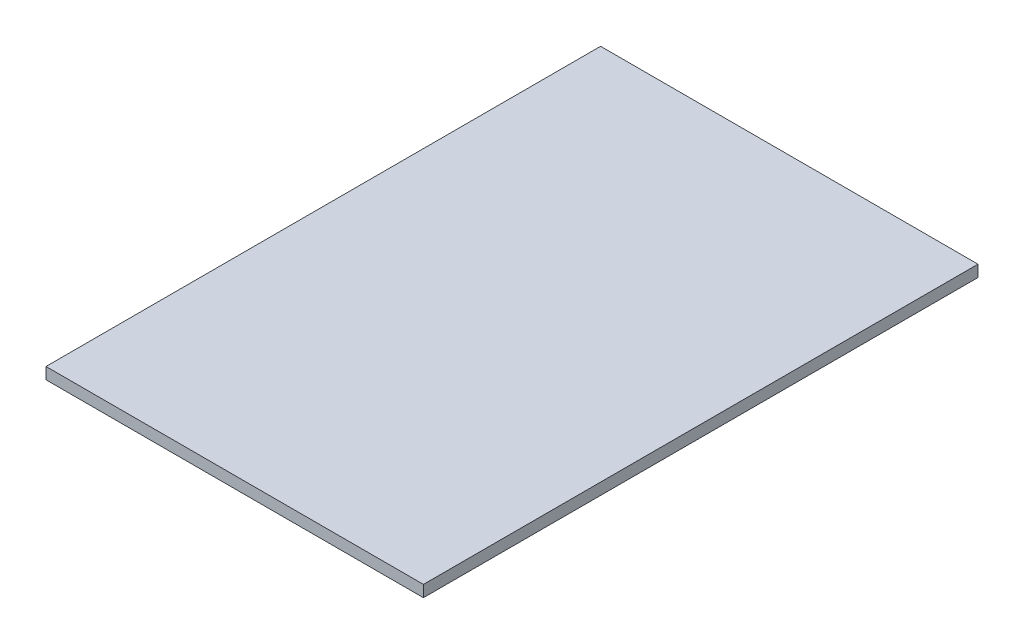
ISO-10303-21;
HEADER;
FILE_DESCRIPTION(('STEP AP214'),'2;1');
FILE_NAME('part.step','',(''),(''),'','','');
FILE_SCHEMA(('AUTOMOTIVE_DESIGN { 1 0 10303 214 1 1 1 1 }'));
ENDSEC;
DATA;
#1=APPLICATION_CONTEXT('core data for automotive mechanical design processes');
#2=APPLICATION_PROTOCOL_DEFINITION('international standard','automotive_design',2000,#1);
#3=PRODUCT_CONTEXT('',#1,'mechanical');
#4=PRODUCT('Part','Part','',(#3));
#5=PRODUCT_RELATED_PRODUCT_CATEGORY('part','',(#4));
#6=PRODUCT_DEFINITION_FORMATION('','',#4);
#7=PRODUCT_DEFINITION_CONTEXT('part definition',#1,'design');
#8=PRODUCT_DEFINITION('design','',#6,#7);
#9=PRODUCT_DEFINITION_SHAPE('','',#8);
#10=(LENGTH_UNIT() NAMED_UNIT(*) SI_UNIT(.MILLI.,.METRE.));
#11=(NAMED_UNIT(*) PLANE_ANGLE_UNIT() SI_UNIT($,.RADIAN.));
#12=(NAMED_UNIT(*) SI_UNIT($,.STERADIAN.) SOLID_ANGLE_UNIT());
#13=UNCERTAINTY_MEASURE_WITH_UNIT(LENGTH_MEASURE(1.E-05),#10,'distance_accuracy_value','');
#14=(GEOMETRIC_REPRESENTATION_CONTEXT(3) GLOBAL_UNCERTAINTY_ASSIGNED_CONTEXT((#13)) GLOBAL_UNIT_ASSIGNED_CONTEXT((#10,
#11,#12)) REPRESENTATION_CONTEXT('',''));
#15=CARTESIAN_POINT('',(0.,0.,0.));
#16=DIRECTION('',(0.,0.,1.));
#17=DIRECTION('',(1.,0.,0.));
#18=AXIS2_PLACEMENT_3D('',#15,#16,#17);
#19=CARTESIAN_POINT('',(0.,1.5,0.));
#20=DIRECTION('',(1.,0.,0.));
#21=DIRECTION('',(0.,0.,-1.));
#22=AXIS2_PLACEMENT_3D('',#19,#20,#21);
#23=PLANE('',#22);
#24=DIRECTION('',(0.,0.,1.));
#25=VECTOR('',#24,1.);
#26=CARTESIAN_POINT('',(0.,0.,0.));
#27=LINE('',#26,#25);
#28=CARTESIAN_POINT('',(0.,0.,-72.));
#29=VERTEX_POINT('',#28);
#30=CARTESIAN_POINT('',(0.,0.,0.));
#31=VERTEX_POINT('',#30);
#32=EDGE_CURVE('E96',#29,#31,#27,.T.);
#33=ORIENTED_EDGE('',*,*,#32,.T.);
#34=DIRECTION('',(0.,-1.,0.));
#35=VECTOR('',#34,1.);
#36=CARTESIAN_POINT('',(0.,1.5,0.));
#37=LINE('',#36,#35);
#38=CARTESIAN_POINT('',(0.,1.5,0.));
#39=VERTEX_POINT('',#38);
#40=EDGE_CURVE('E11',#39,#31,#37,.T.);
#41=ORIENTED_EDGE('',*,*,#40,.F.);
#42=DIRECTION('',(0.,0.,1.));
#43=VECTOR('',#42,1.);
#44=CARTESIAN_POINT('',(0.,1.5,0.));
#45=LINE('',#44,#43);
#46=CARTESIAN_POINT('',(0.,1.5,-72.));
#47=VERTEX_POINT('',#46);
#48=EDGE_CURVE('E84',#47,#39,#45,.T.);
#49=ORIENTED_EDGE('',*,*,#48,.F.);
#50=DIRECTION('',(0.,-1.,0.));
#51=VECTOR('',#50,1.);
#52=CARTESIAN_POINT('',(0.,1.5,-72.));
#53=LINE('',#52,#51);
#54=EDGE_CURVE('E92',#47,#29,#53,.T.);
#55=ORIENTED_EDGE('',*,*,#54,.T.);
#56=EDGE_LOOP('',(#33,#41,#49,#55));
#57=FACE_BOUND('',#56,.T.);
#58=ADVANCED_FACE('F33',(#57),#23,.F.);
#59=CARTESIAN_POINT('',(0.,1.5,0.));
#60=DIRECTION('',(0.,0.,-1.));
#61=DIRECTION('',(-1.,0.,0.));
#62=AXIS2_PLACEMENT_3D('',#59,#60,#61);
#63=PLANE('',#62);
#64=DIRECTION('',(1.,0.,0.));
#65=VECTOR('',#64,1.);
#66=CARTESIAN_POINT('',(0.,0.,0.));
#67=LINE('',#66,#65);
#68=CARTESIAN_POINT('',(49.,0.,0.));
#69=VERTEX_POINT('',#68);
#70=EDGE_CURVE('E88',#31,#69,#67,.T.);
#71=ORIENTED_EDGE('',*,*,#70,.T.);
#72=DIRECTION('',(0.,-1.,0.));
#73=VECTOR('',#72,1.);
#74=CARTESIAN_POINT('',(49.,1.5,0.));
#75=LINE('',#74,#73);
#76=CARTESIAN_POINT('',(49.,1.5,0.));
#77=VERTEX_POINT('',#76);
#78=EDGE_CURVE('E41',#77,#69,#75,.T.);
#79=ORIENTED_EDGE('',*,*,#78,.F.);
#80=DIRECTION('',(1.,0.,0.));
#81=VECTOR('',#80,1.);
#82=CARTESIAN_POINT('',(0.,1.5,0.));
#83=LINE('',#82,#81);
#84=EDGE_CURVE('E79',#39,#77,#83,.T.);
#85=ORIENTED_EDGE('',*,*,#84,.F.);
#86=ORIENTED_EDGE('',*,*,#40,.T.);
#87=EDGE_LOOP('',(#71,#79,#85,#86));
#88=FACE_BOUND('',#87,.T.);
#89=ADVANCED_FACE('F87',(#88),#63,.F.);
#90=CARTESIAN_POINT('',(49.,1.5,0.));
#91=DIRECTION('',(-1.,0.,0.));
#92=DIRECTION('',(0.,0.,1.));
#93=AXIS2_PLACEMENT_3D('',#90,#91,#92);
#94=PLANE('',#93);
#95=DIRECTION('',(0.,0.,-1.));
#96=VECTOR('',#95,1.);
#97=CARTESIAN_POINT('',(49.,0.,0.));
#98=LINE('',#97,#96);
#99=CARTESIAN_POINT('',(49.,0.,-72.));
#100=VERTEX_POINT('',#99);
#101=EDGE_CURVE('E66',#69,#100,#98,.T.);
#102=ORIENTED_EDGE('',*,*,#101,.T.);
#103=DIRECTION('',(0.,-1.,0.));
#104=VECTOR('',#103,1.);
#105=CARTESIAN_POINT('',(49.,1.5,-72.));
#106=LINE('',#105,#104);
#107=CARTESIAN_POINT('',(49.,1.5,-72.));
#108=VERTEX_POINT('',#107);
#109=EDGE_CURVE('E89',#108,#100,#106,.T.);
#110=ORIENTED_EDGE('',*,*,#109,.F.);
#111=DIRECTION('',(0.,0.,-1.));
#112=VECTOR('',#111,1.);
#113=CARTESIAN_POINT('',(49.,1.5,0.));
#114=LINE('',#113,#112);
#115=EDGE_CURVE('E82',#77,#108,#114,.T.);
#116=ORIENTED_EDGE('',*,*,#115,.F.);
#117=ORIENTED_EDGE('',*,*,#78,.T.);
#118=EDGE_LOOP('',(#102,#110,#116,#117));
#119=FACE_BOUND('',#118,.T.);
#120=ADVANCED_FACE('F90',(#119),#94,.F.);
#121=CARTESIAN_POINT('',(0.,1.5,-72.));
#122=DIRECTION('',(0.,0.,1.));
#123=DIRECTION('',(1.,0.,0.));
#124=AXIS2_PLACEMENT_3D('',#121,#122,#123);
#125=PLANE('',#124);
#126=DIRECTION('',(-1.,0.,0.));
#127=VECTOR('',#126,1.);
#128=CARTESIAN_POINT('',(0.,0.,-72.));
#129=LINE('',#128,#127);
#130=EDGE_CURVE('E72',#100,#29,#129,.T.);
#131=ORIENTED_EDGE('',*,*,#130,.T.);
#132=ORIENTED_EDGE('',*,*,#54,.F.);
#133=DIRECTION('',(-1.,0.,0.));
#134=VECTOR('',#133,1.);
#135=CARTESIAN_POINT('',(0.,1.5,-72.));
#136=LINE('',#135,#134);
#137=EDGE_CURVE('E49',#108,#47,#136,.T.);
#138=ORIENTED_EDGE('',*,*,#137,.F.);
#139=ORIENTED_EDGE('',*,*,#109,.T.);
#140=EDGE_LOOP('',(#131,#132,#138,#139));
#141=FACE_BOUND('',#140,.T.);
#142=ADVANCED_FACE('F103',(#141),#125,.F.);
#143=CARTESIAN_POINT('',(0.,1.5,0.));
#144=DIRECTION('',(0.,-1.,0.));
#145=DIRECTION('',(0.,0.,-1.));
#146=AXIS2_PLACEMENT_3D('',#143,#144,#145);
#147=PLANE('',#146);
#148=ORIENTED_EDGE('',*,*,#48,.T.);
#149=ORIENTED_EDGE('',*,*,#84,.T.);
#150=ORIENTED_EDGE('',*,*,#115,.T.);
#151=ORIENTED_EDGE('',*,*,#137,.T.);
#152=EDGE_LOOP('',(#148,#149,#150,#151));
#153=FACE_BOUND('',#152,.T.);
#154=ADVANCED_FACE('F80',(#153),#147,.F.);
#155=CARTESIAN_POINT('',(0.,0.,0.));
#156=DIRECTION('',(0.,-1.,0.));
#157=DIRECTION('',(0.,0.,-1.));
#158=AXIS2_PLACEMENT_3D('',#155,#156,#157);
#159=PLANE('',#158);
#160=ORIENTED_EDGE('',*,*,#32,.F.);
#161=ORIENTED_EDGE('',*,*,#130,.F.);
#162=ORIENTED_EDGE('',*,*,#101,.F.);
#163=ORIENTED_EDGE('',*,*,#70,.F.);
#164=EDGE_LOOP('',(#160,#161,#162,#163));
#165=FACE_BOUND('',#164,.T.);
#166=ADVANCED_FACE('F106',(#165),#159,.T.);
#167=CLOSED_SHELL('',(#58,#89,#120,#142,#154,#166));
#168=MANIFOLD_SOLID_BREP('B2',#167);
#169=ADVANCED_BREP_SHAPE_REPRESENTATION('',(#18,#168),#14);
#170=SHAPE_DEFINITION_REPRESENTATION(#9,#169);
ENDSEC;
END-ISO-10303-21;
